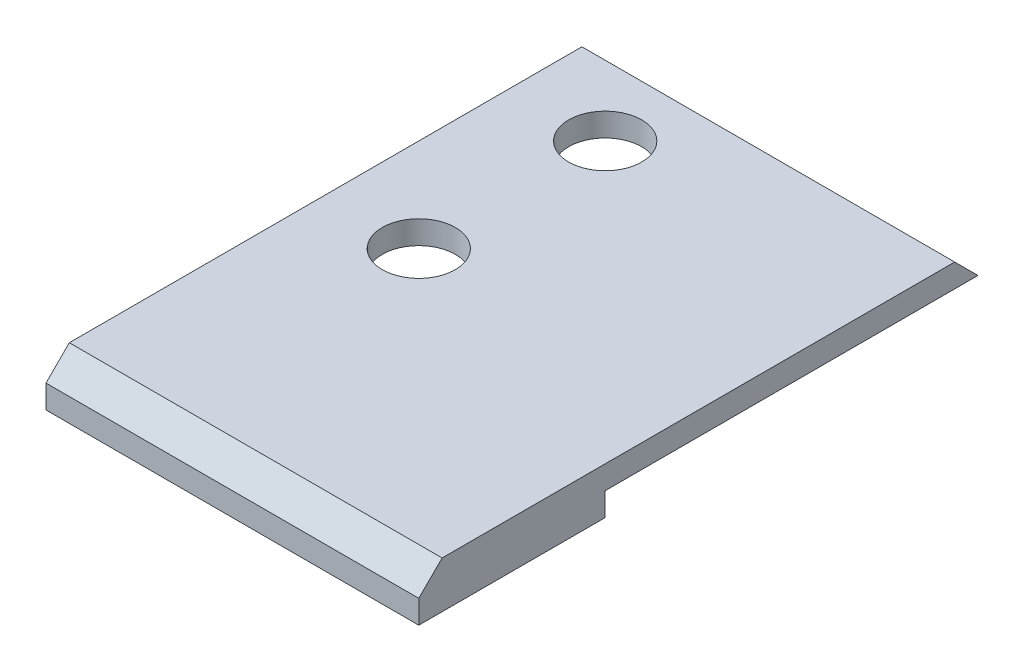
ISO-10303-21;
HEADER;
FILE_DESCRIPTION(('STEP AP214'),'2;1');
FILE_NAME('part.step','',(''),(''),'','','');
FILE_SCHEMA(('AUTOMOTIVE_DESIGN { 1 0 10303 214 1 1 1 1 }'));
ENDSEC;
DATA;
#1=APPLICATION_CONTEXT('core data for automotive mechanical design processes');
#2=APPLICATION_PROTOCOL_DEFINITION('international standard','automotive_design',2000,#1);
#3=PRODUCT_CONTEXT('',#1,'mechanical');
#4=PRODUCT('Part','Part','',(#3));
#5=PRODUCT_RELATED_PRODUCT_CATEGORY('part','',(#4));
#6=PRODUCT_DEFINITION_FORMATION('','',#4);
#7=PRODUCT_DEFINITION_CONTEXT('part definition',#1,'design');
#8=PRODUCT_DEFINITION('design','',#6,#7);
#9=PRODUCT_DEFINITION_SHAPE('','',#8);
#10=(LENGTH_UNIT() NAMED_UNIT(*) SI_UNIT(.MILLI.,.METRE.));
#11=(NAMED_UNIT(*) PLANE_ANGLE_UNIT() SI_UNIT($,.RADIAN.));
#12=(NAMED_UNIT(*) SI_UNIT($,.STERADIAN.) SOLID_ANGLE_UNIT());
#13=UNCERTAINTY_MEASURE_WITH_UNIT(LENGTH_MEASURE(1.E-05),#10,'distance_accuracy_value','');
#14=(GEOMETRIC_REPRESENTATION_CONTEXT(3) GLOBAL_UNCERTAINTY_ASSIGNED_CONTEXT((#13)) GLOBAL_UNIT_ASSIGNED_CONTEXT((#10,
#11,#12)) REPRESENTATION_CONTEXT('',''));
#15=CARTESIAN_POINT('',(0.,0.,0.));
#16=DIRECTION('',(0.,0.,1.));
#17=DIRECTION('',(1.,0.,0.));
#18=AXIS2_PLACEMENT_3D('',#15,#16,#17);
#19=CARTESIAN_POINT('',(0.,-1.5875,0.));
#20=DIRECTION('',(1.,0.,0.));
#21=DIRECTION('',(0.,0.,-1.));
#22=AXIS2_PLACEMENT_3D('',#19,#20,#21);
#23=PLANE('',#22);
#24=DIRECTION('',(0.,0.,-1.));
#25=VECTOR('',#24,1.);
#26=CARTESIAN_POINT('',(0.,0.,0.));
#27=LINE('',#26,#25);
#28=CARTESIAN_POINT('',(0.,0.,-1.5875));
#29=VERTEX_POINT('',#28);
#30=CARTESIAN_POINT('',(0.,0.,-36.5125));
#31=VERTEX_POINT('',#30);
#32=EDGE_CURVE('E132',#29,#31,#27,.T.);
#33=ORIENTED_EDGE('',*,*,#32,.T.);
#34=DIRECTION('',(0.,-0.707106781186546,-0.707106781186549));
#35=VECTOR('',#34,1.);
#36=CARTESIAN_POINT('',(0.,-1.5875,-38.1));
#37=LINE('',#36,#35);
#38=CARTESIAN_POINT('',(0.,-1.5875,-38.1));
#39=VERTEX_POINT('',#38);
#40=EDGE_CURVE('E40',#31,#39,#37,.T.);
#41=ORIENTED_EDGE('',*,*,#40,.T.);
#42=DIRECTION('',(0.,0.,-1.));
#43=VECTOR('',#42,1.);
#44=CARTESIAN_POINT('',(0.,-1.5875,0.));
#45=LINE('',#44,#43);
#46=CARTESIAN_POINT('',(0.,-1.5875,-12.7));
#47=VERTEX_POINT('',#46);
#48=EDGE_CURVE('E149',#47,#39,#45,.T.);
#49=ORIENTED_EDGE('',*,*,#48,.F.);
#50=DIRECTION('',(0.,1.,0.));
#51=VECTOR('',#50,1.);
#52=CARTESIAN_POINT('',(0.,-3.175,-12.7));
#53=LINE('',#52,#51);
#54=CARTESIAN_POINT('',(0.,-3.175,-12.7));
#55=VERTEX_POINT('',#54);
#56=EDGE_CURVE('E120',#55,#47,#53,.T.);
#57=ORIENTED_EDGE('',*,*,#56,.F.);
#58=DIRECTION('',(0.,0.,-1.));
#59=VECTOR('',#58,1.);
#60=CARTESIAN_POINT('',(0.,-3.175,0.));
#61=LINE('',#60,#59);
#62=CARTESIAN_POINT('',(0.,-3.175,0.));
#63=VERTEX_POINT('',#62);
#64=EDGE_CURVE('E101',#63,#55,#61,.T.);
#65=ORIENTED_EDGE('',*,*,#64,.F.);
#66=DIRECTION('',(0.,1.,0.));
#67=VECTOR('',#66,1.);
#68=CARTESIAN_POINT('',(0.,-3.175,0.));
#69=LINE('',#68,#67);
#70=CARTESIAN_POINT('',(0.,-1.58750000000001,0.));
#71=VERTEX_POINT('',#70);
#72=EDGE_CURVE('E112',#63,#71,#69,.T.);
#73=ORIENTED_EDGE('',*,*,#72,.T.);
#74=DIRECTION('',(0.,-0.707106781186549,0.707106781186546));
#75=VECTOR('',#74,1.);
#76=CARTESIAN_POINT('',(0.,0.,-1.5875));
#77=LINE('',#76,#75);
#78=EDGE_CURVE('E161',#71,#29,#77,.F.);
#79=ORIENTED_EDGE('',*,*,#78,.T.);
#80=EDGE_LOOP('',(#33,#41,#49,#57,#65,#73,#79));
#81=FACE_BOUND('',#80,.T.);
#82=ADVANCED_FACE('F32',(#81),#23,.F.);
#83=CARTESIAN_POINT('',(6.35,-1.5875,-19.05));
#84=DIRECTION('',(0.,1.,0.));
#85=DIRECTION('',(0.,0.,1.));
#86=AXIS2_PLACEMENT_3D('',#83,#84,#85);
#87=CYLINDRICAL_SURFACE('',#86,2.4892);
#88=CARTESIAN_POINT('',(6.35,-1.5875,-19.05));
#89=DIRECTION('',(0.,1.,0.));
#90=DIRECTION('',(0.,0.,1.));
#91=AXIS2_PLACEMENT_3D('',#88,#89,#90);
#92=CIRCLE('',#91,2.4892);
#93=CARTESIAN_POINT('',(6.35,-1.5875,-16.5608));
#94=VERTEX_POINT('',#93);
#95=EDGE_CURVE('E131',#94,#94,#92,.T.);
#96=ORIENTED_EDGE('',*,*,#95,.F.);
#97=EDGE_LOOP('',(#96));
#98=FACE_BOUND('',#97,.T.);
#99=CARTESIAN_POINT('',(6.35,0.,-19.05));
#100=DIRECTION('',(0.,1.,0.));
#101=DIRECTION('',(0.,0.,1.));
#102=AXIS2_PLACEMENT_3D('',#99,#100,#101);
#103=CIRCLE('',#102,2.4892);
#104=CARTESIAN_POINT('',(6.35,0.,-16.5608));
#105=VERTEX_POINT('',#104);
#106=EDGE_CURVE('E175',#105,#105,#103,.T.);
#107=ORIENTED_EDGE('',*,*,#106,.T.);
#108=EDGE_LOOP('',(#107));
#109=FACE_BOUND('',#108,.T.);
#110=ADVANCED_FACE('F189',(#98,#109),#87,.F.);
#111=CARTESIAN_POINT('',(6.35,-1.5875,-31.75));
#112=DIRECTION('',(0.,1.,0.));
#113=DIRECTION('',(0.,0.,1.));
#114=AXIS2_PLACEMENT_3D('',#111,#112,#113);
#115=CYLINDRICAL_SURFACE('',#114,2.4892);
#116=CARTESIAN_POINT('',(6.35,-1.5875,-31.75));
#117=DIRECTION('',(0.,1.,0.));
#118=DIRECTION('',(0.,0.,1.));
#119=AXIS2_PLACEMENT_3D('',#116,#117,#118);
#120=CIRCLE('',#119,2.4892);
#121=CARTESIAN_POINT('',(6.35,-1.5875,-29.2608));
#122=VERTEX_POINT('',#121);
#123=EDGE_CURVE('E128',#122,#122,#120,.T.);
#124=ORIENTED_EDGE('',*,*,#123,.F.);
#125=EDGE_LOOP('',(#124));
#126=FACE_BOUND('',#125,.T.);
#127=CARTESIAN_POINT('',(6.35,0.,-31.75));
#128=DIRECTION('',(0.,1.,0.));
#129=DIRECTION('',(0.,0.,1.));
#130=AXIS2_PLACEMENT_3D('',#127,#128,#129);
#131=CIRCLE('',#130,2.4892);
#132=CARTESIAN_POINT('',(6.35,0.,-29.2608));
#133=VERTEX_POINT('',#132);
#134=EDGE_CURVE('E119',#133,#133,#131,.T.);
#135=ORIENTED_EDGE('',*,*,#134,.T.);
#136=EDGE_LOOP('',(#135));
#137=FACE_BOUND('',#136,.T.);
#138=ADVANCED_FACE('F181',(#126,#137),#115,.F.);
#139=CARTESIAN_POINT('',(25.4,-1.5875,0.));
#140=DIRECTION('',(1.,0.,0.));
#141=DIRECTION('',(0.,0.,-1.));
#142=AXIS2_PLACEMENT_3D('',#139,#140,#141);
#143=PLANE('',#142);
#144=DIRECTION('',(0.,0.,-1.));
#145=VECTOR('',#144,1.);
#146=CARTESIAN_POINT('',(25.4,-1.5875,0.));
#147=LINE('',#146,#145);
#148=CARTESIAN_POINT('',(25.4,-1.5875,-12.7));
#149=VERTEX_POINT('',#148);
#150=CARTESIAN_POINT('',(25.4,-1.5875,-38.1));
#151=VERTEX_POINT('',#150);
#152=EDGE_CURVE('E144',#149,#151,#147,.T.);
#153=ORIENTED_EDGE('',*,*,#152,.T.);
#154=DIRECTION('',(0.,0.707106781186546,0.707106781186549));
#155=VECTOR('',#154,1.);
#156=CARTESIAN_POINT('',(25.4,17.4625,-19.0499999999999));
#157=LINE('',#156,#155);
#158=CARTESIAN_POINT('',(25.4,0.,-36.5125));
#159=VERTEX_POINT('',#158);
#160=EDGE_CURVE('E155',#151,#159,#157,.T.);
#161=ORIENTED_EDGE('',*,*,#160,.T.);
#162=DIRECTION('',(0.,0.,-1.));
#163=VECTOR('',#162,1.);
#164=CARTESIAN_POINT('',(25.4,0.,0.));
#165=LINE('',#164,#163);
#166=CARTESIAN_POINT('',(25.4,0.,-1.5875));
#167=VERTEX_POINT('',#166);
#168=EDGE_CURVE('E172',#167,#159,#165,.T.);
#169=ORIENTED_EDGE('',*,*,#168,.F.);
#170=DIRECTION('',(0.,0.707106781186549,-0.707106781186546));
#171=VECTOR('',#170,1.);
#172=CARTESIAN_POINT('',(25.4,-1.5875,0.));
#173=LINE('',#172,#171);
#174=CARTESIAN_POINT('',(25.4,-1.58750000000001,0.));
#175=VERTEX_POINT('',#174);
#176=EDGE_CURVE('E98',#167,#175,#173,.F.);
#177=ORIENTED_EDGE('',*,*,#176,.T.);
#178=DIRECTION('',(0.,1.,0.));
#179=VECTOR('',#178,1.);
#180=CARTESIAN_POINT('',(25.4,-3.175,0.));
#181=LINE('',#180,#179);
#182=CARTESIAN_POINT('',(25.4,-3.175,0.));
#183=VERTEX_POINT('',#182);
#184=EDGE_CURVE('E91',#183,#175,#181,.T.);
#185=ORIENTED_EDGE('',*,*,#184,.F.);
#186=DIRECTION('',(0.,0.,-1.));
#187=VECTOR('',#186,1.);
#188=CARTESIAN_POINT('',(25.4,-3.175,0.));
#189=LINE('',#188,#187);
#190=CARTESIAN_POINT('',(25.4,-3.175,-12.7));
#191=VERTEX_POINT('',#190);
#192=EDGE_CURVE('E96',#183,#191,#189,.T.);
#193=ORIENTED_EDGE('',*,*,#192,.T.);
#194=DIRECTION('',(0.,1.,0.));
#195=VECTOR('',#194,1.);
#196=CARTESIAN_POINT('',(25.4,-3.175,-12.7));
#197=LINE('',#196,#195);
#198=EDGE_CURVE('E100',#191,#149,#197,.T.);
#199=ORIENTED_EDGE('',*,*,#198,.T.);
#200=EDGE_LOOP('',(#153,#161,#169,#177,#185,#193,#199));
#201=FACE_BOUND('',#200,.T.);
#202=ADVANCED_FACE('F94',(#201),#143,.T.);
#203=CARTESIAN_POINT('',(0.,-1.5875,0.));
#204=DIRECTION('',(0.,1.,0.));
#205=DIRECTION('',(0.,0.,1.));
#206=AXIS2_PLACEMENT_3D('',#203,#204,#205);
#207=PLANE('',#206);
#208=ORIENTED_EDGE('',*,*,#123,.T.);
#209=EDGE_LOOP('',(#208));
#210=FACE_BOUND('',#209,.T.);
#211=ORIENTED_EDGE('',*,*,#95,.T.);
#212=EDGE_LOOP('',(#211));
#213=FACE_BOUND('',#212,.T.);
#214=DIRECTION('',(1.,0.,0.));
#215=VECTOR('',#214,1.);
#216=CARTESIAN_POINT('',(0.,-1.5875,-12.7));
#217=LINE('',#216,#215);
#218=EDGE_CURVE('E135',#47,#149,#217,.T.);
#219=ORIENTED_EDGE('',*,*,#218,.F.);
#220=ORIENTED_EDGE('',*,*,#48,.T.);
#221=DIRECTION('',(1.,0.,0.));
#222=VECTOR('',#221,1.);
#223=CARTESIAN_POINT('',(0.,-1.5875,-38.1));
#224=LINE('',#223,#222);
#225=EDGE_CURVE('E138',#39,#151,#224,.T.);
#226=ORIENTED_EDGE('',*,*,#225,.T.);
#227=ORIENTED_EDGE('',*,*,#152,.F.);
#228=EDGE_LOOP('',(#219,#220,#226,#227));
#229=FACE_BOUND('',#228,.T.);
#230=ADVANCED_FACE('F170',(#210,#213,#229),#207,.F.);
#231=CARTESIAN_POINT('',(0.,0.,0.));
#232=DIRECTION('',(0.,1.,0.));
#233=DIRECTION('',(0.,0.,1.));
#234=AXIS2_PLACEMENT_3D('',#231,#232,#233);
#235=PLANE('',#234);
#236=ORIENTED_EDGE('',*,*,#134,.F.);
#237=EDGE_LOOP('',(#236));
#238=FACE_BOUND('',#237,.T.);
#239=ORIENTED_EDGE('',*,*,#106,.F.);
#240=EDGE_LOOP('',(#239));
#241=FACE_BOUND('',#240,.T.);
#242=ORIENTED_EDGE('',*,*,#168,.T.);
#243=DIRECTION('',(-1.,0.,0.));
#244=VECTOR('',#243,1.);
#245=CARTESIAN_POINT('',(0.,0.,-36.5125));
#246=LINE('',#245,#244);
#247=EDGE_CURVE('E53',#159,#31,#246,.T.);
#248=ORIENTED_EDGE('',*,*,#247,.T.);
#249=ORIENTED_EDGE('',*,*,#32,.F.);
#250=DIRECTION('',(1.,0.,0.));
#251=VECTOR('',#250,1.);
#252=CARTESIAN_POINT('',(0.,0.,-1.5875));
#253=LINE('',#252,#251);
#254=EDGE_CURVE('E157',#29,#167,#253,.T.);
#255=ORIENTED_EDGE('',*,*,#254,.T.);
#256=EDGE_LOOP('',(#242,#248,#249,#255));
#257=FACE_BOUND('',#256,.T.);
#258=ADVANCED_FACE('F173',(#238,#241,#257),#235,.T.);
#259=CARTESIAN_POINT('',(0.,-3.175,-12.7));
#260=DIRECTION('',(0.,0.,1.));
#261=DIRECTION('',(1.,0.,0.));
#262=AXIS2_PLACEMENT_3D('',#259,#260,#261);
#263=PLANE('',#262);
#264=ORIENTED_EDGE('',*,*,#56,.T.);
#265=ORIENTED_EDGE('',*,*,#218,.T.);
#266=ORIENTED_EDGE('',*,*,#198,.F.);
#267=DIRECTION('',(1.,0.,0.));
#268=VECTOR('',#267,1.);
#269=CARTESIAN_POINT('',(0.,-3.175,-12.7));
#270=LINE('',#269,#268);
#271=EDGE_CURVE('E108',#55,#191,#270,.T.);
#272=ORIENTED_EDGE('',*,*,#271,.F.);
#273=EDGE_LOOP('',(#264,#265,#266,#272));
#274=FACE_BOUND('',#273,.T.);
#275=ADVANCED_FACE('F185',(#274),#263,.F.);
#276=CARTESIAN_POINT('',(0.,-3.175,0.));
#277=DIRECTION('',(0.,0.,1.));
#278=DIRECTION('',(1.,0.,0.));
#279=AXIS2_PLACEMENT_3D('',#276,#277,#278);
#280=PLANE('',#279);
#281=ORIENTED_EDGE('',*,*,#184,.T.);
#282=DIRECTION('',(-1.,0.,0.));
#283=VECTOR('',#282,1.);
#284=CARTESIAN_POINT('',(0.,-1.58750000000001,0.));
#285=LINE('',#284,#283);
#286=EDGE_CURVE('E11',#175,#71,#285,.T.);
#287=ORIENTED_EDGE('',*,*,#286,.T.);
#288=ORIENTED_EDGE('',*,*,#72,.F.);
#289=DIRECTION('',(1.,0.,0.));
#290=VECTOR('',#289,1.);
#291=CARTESIAN_POINT('',(0.,-3.175,0.));
#292=LINE('',#291,#290);
#293=EDGE_CURVE('E106',#63,#183,#292,.T.);
#294=ORIENTED_EDGE('',*,*,#293,.T.);
#295=EDGE_LOOP('',(#281,#287,#288,#294));
#296=FACE_BOUND('',#295,.T.);
#297=ADVANCED_FACE('F111',(#296),#280,.T.);
#298=CARTESIAN_POINT('',(0.,-3.175,0.));
#299=DIRECTION('',(0.,1.,0.));
#300=DIRECTION('',(0.,0.,1.));
#301=AXIS2_PLACEMENT_3D('',#298,#299,#300);
#302=PLANE('',#301);
#303=ORIENTED_EDGE('',*,*,#293,.F.);
#304=ORIENTED_EDGE('',*,*,#64,.T.);
#305=ORIENTED_EDGE('',*,*,#271,.T.);
#306=ORIENTED_EDGE('',*,*,#192,.F.);
#307=EDGE_LOOP('',(#303,#304,#305,#306));
#308=FACE_BOUND('',#307,.T.);
#309=ADVANCED_FACE('F105',(#308),#302,.F.);
#310=CARTESIAN_POINT('',(0.,-1.5875,-38.1));
#311=DIRECTION('',(0.,0.707106781186549,-0.707106781186546));
#312=DIRECTION('',(-1.,0.,0.));
#313=AXIS2_PLACEMENT_3D('',#310,#311,#312);
#314=PLANE('',#313);
#315=ORIENTED_EDGE('',*,*,#40,.F.);
#316=ORIENTED_EDGE('',*,*,#247,.F.);
#317=ORIENTED_EDGE('',*,*,#160,.F.);
#318=ORIENTED_EDGE('',*,*,#225,.F.);
#319=EDGE_LOOP('',(#315,#316,#317,#318));
#320=FACE_BOUND('',#319,.T.);
#321=ADVANCED_FACE('F171',(#320),#314,.T.);
#322=CARTESIAN_POINT('',(0.,0.,-1.5875));
#323=DIRECTION('',(0.,-0.707106781186546,-0.707106781186549));
#324=DIRECTION('',(1.,0.,0.));
#325=AXIS2_PLACEMENT_3D('',#322,#323,#324);
#326=PLANE('',#325);
#327=ORIENTED_EDGE('',*,*,#78,.F.);
#328=ORIENTED_EDGE('',*,*,#286,.F.);
#329=ORIENTED_EDGE('',*,*,#176,.F.);
#330=ORIENTED_EDGE('',*,*,#254,.F.);
#331=EDGE_LOOP('',(#327,#328,#329,#330));
#332=FACE_BOUND('',#331,.T.);
#333=ADVANCED_FACE('F34',(#332),#326,.F.);
#334=CLOSED_SHELL('',(#82,#110,#138,#202,#230,#258,#275,#297,#309,#321,#333));
#335=MANIFOLD_SOLID_BREP('B2',#334);
#336=ADVANCED_BREP_SHAPE_REPRESENTATION('',(#18,#335),#14);
#337=SHAPE_DEFINITION_REPRESENTATION(#9,#336);
ENDSEC;
END-ISO-10303-21;
